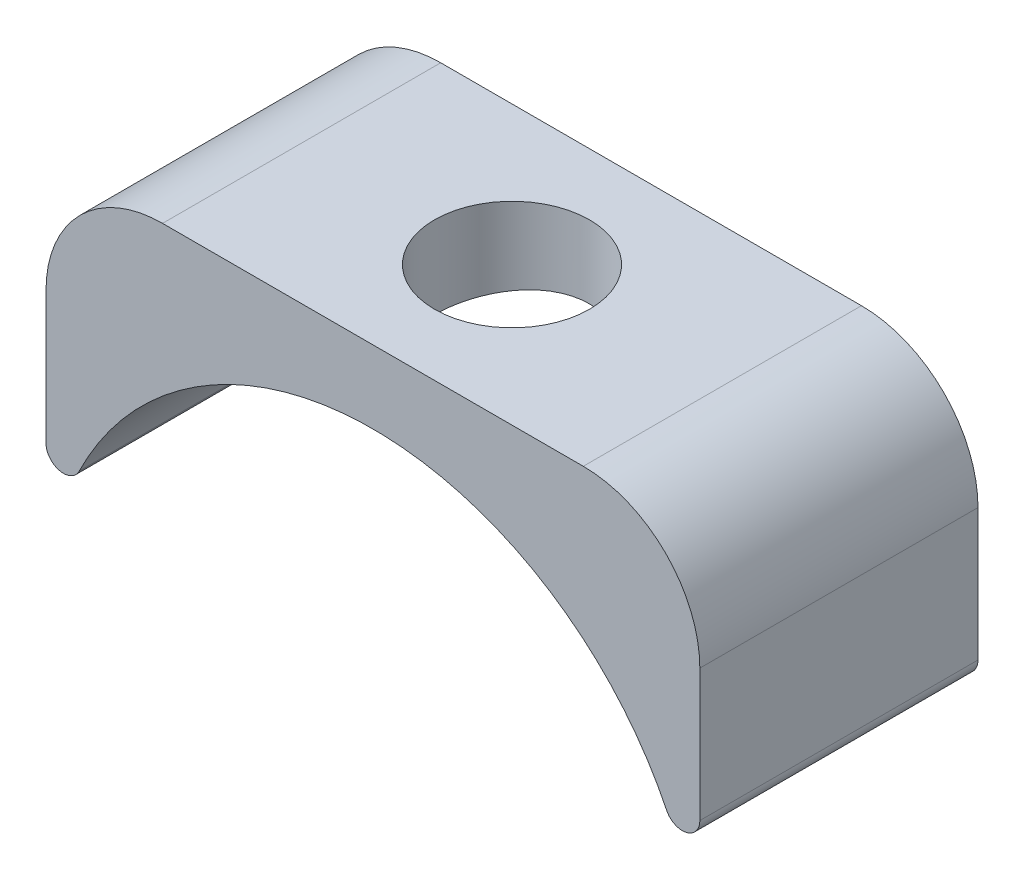
ISO-10303-21;
HEADER;
FILE_DESCRIPTION(('STEP AP214'),'2;1');
FILE_NAME('part.step','',(''),(''),'','','');
FILE_SCHEMA(('AUTOMOTIVE_DESIGN { 1 0 10303 214 1 1 1 1 }'));
ENDSEC;
DATA;
#1=APPLICATION_CONTEXT('core data for automotive mechanical design processes');
#2=APPLICATION_PROTOCOL_DEFINITION('international standard','automotive_design',2000,#1);
#3=PRODUCT_CONTEXT('',#1,'mechanical');
#4=PRODUCT('Part','Part','',(#3));
#5=PRODUCT_RELATED_PRODUCT_CATEGORY('part','',(#4));
#6=PRODUCT_DEFINITION_FORMATION('','',#4);
#7=PRODUCT_DEFINITION_CONTEXT('part definition',#1,'design');
#8=PRODUCT_DEFINITION('design','',#6,#7);
#9=PRODUCT_DEFINITION_SHAPE('','',#8);
#10=(LENGTH_UNIT() NAMED_UNIT(*) SI_UNIT(.MILLI.,.METRE.));
#11=(NAMED_UNIT(*) PLANE_ANGLE_UNIT() SI_UNIT($,.RADIAN.));
#12=(NAMED_UNIT(*) SI_UNIT($,.STERADIAN.) SOLID_ANGLE_UNIT());
#13=UNCERTAINTY_MEASURE_WITH_UNIT(LENGTH_MEASURE(1.E-05),#10,'distance_accuracy_value','');
#14=(GEOMETRIC_REPRESENTATION_CONTEXT(3) GLOBAL_UNCERTAINTY_ASSIGNED_CONTEXT((#13)) GLOBAL_UNIT_ASSIGNED_CONTEXT((#10,
#11,#12)) REPRESENTATION_CONTEXT('',''));
#15=CARTESIAN_POINT('',(0.,0.,0.));
#16=DIRECTION('',(0.,0.,1.));
#17=DIRECTION('',(1.,0.,0.));
#18=AXIS2_PLACEMENT_3D('',#15,#16,#17);
#19=CARTESIAN_POINT('',(0.,0.,6.0625));
#20=DIRECTION('',(0.,0.,-1.));
#21=DIRECTION('',(-1.,0.,0.));
#22=AXIS2_PLACEMENT_3D('',#19,#20,#21);
#23=CYLINDRICAL_SURFACE('',#22,14.25);
#24=CARTESIAN_POINT('',(0.,0.,-6.0625));
#25=DIRECTION('',(0.,0.,-1.));
#26=DIRECTION('',(1.,0.,0.));
#27=AXIS2_PLACEMENT_3D('',#24,#25,#26);
#28=CIRCLE('',#27,14.25);
#29=CARTESIAN_POINT('',(-12.8033573141487,6.2559205146993,-6.0625));
#30=VERTEX_POINT('',#29);
#31=CARTESIAN_POINT('',(12.8033573141487,6.2559205146993,-6.0625));
#32=VERTEX_POINT('',#31);
#33=EDGE_CURVE('E147',#30,#32,#28,.T.);
#34=ORIENTED_EDGE('',*,*,#33,.T.);
#35=DIRECTION('',(0.,0.,-1.));
#36=VECTOR('',#35,1.);
#37=CARTESIAN_POINT('',(12.8033573141487,6.2559205146993,6.0625));
#38=LINE('',#37,#36);
#39=CARTESIAN_POINT('',(12.8033573141487,6.2559205146993,6.0625));
#40=VERTEX_POINT('',#39);
#41=EDGE_CURVE('E130',#40,#32,#38,.T.);
#42=ORIENTED_EDGE('',*,*,#41,.F.);
#43=CARTESIAN_POINT('',(0.,0.,6.0625));
#44=DIRECTION('',(0.,0.,-1.));
#45=DIRECTION('',(1.,0.,0.));
#46=AXIS2_PLACEMENT_3D('',#43,#44,#45);
#47=CIRCLE('',#46,14.25);
#48=CARTESIAN_POINT('',(-12.8033573141487,6.2559205146993,6.0625));
#49=VERTEX_POINT('',#48);
#50=EDGE_CURVE('E121',#49,#40,#47,.T.);
#51=ORIENTED_EDGE('',*,*,#50,.F.);
#52=DIRECTION('',(0.,0.,-1.));
#53=VECTOR('',#52,1.);
#54=CARTESIAN_POINT('',(-12.8033573141487,6.2559205146993,6.0625));
#55=LINE('',#54,#53);
#56=EDGE_CURVE('E157',#49,#30,#55,.T.);
#57=ORIENTED_EDGE('',*,*,#56,.T.);
#58=EDGE_LOOP('',(#34,#42,#51,#57));
#59=FACE_BOUND('',#58,.T.);
#60=CARTESIAN_POINT('',(0.,14.25,-3.3782));
#61=CARTESIAN_POINT('',(0.186954700350283,14.2499966694241,-3.37819422864205));
#62=CARTESIAN_POINT('',(0.373976018191338,14.2462838619071,-3.36262816176052));
#63=CARTESIAN_POINT('',(0.742679010707961,14.2318319752717,-3.3008561035296));
#64=CARTESIAN_POINT('',(0.924357246047173,14.2210884696497,-3.25463080898669));
#65=CARTESIAN_POINT('',(1.27699467379397,14.1937676751066,-3.1330910646087));
#66=CARTESIAN_POINT('',(1.44796577307573,14.1771970070486,-3.05780961914467));
#67=CARTESIAN_POINT('',(1.77484938231894,14.1399967535684,-2.88040589011572));
#68=CARTESIAN_POINT('',(1.9307617619454,14.1193671330202,-2.77828337426664));
#69=CARTESIAN_POINT('',(2.22601363231564,14.0758669577643,-2.54808207249761));
#70=CARTESIAN_POINT('',(2.36503202327017,14.0529646723246,-2.41959741821536));
#71=CARTESIAN_POINT('',(2.61976164903309,14.0077165749994,-2.14118902773542));
#72=CARTESIAN_POINT('',(2.73547050146267,13.9853708201992,-1.99126310278241));
#73=CARTESIAN_POINT('',(2.94176642670209,13.9434491293676,-1.67178587326716));
#74=CARTESIAN_POINT('',(3.03200175817358,13.9239136452175,-1.50200165194687));
#75=CARTESIAN_POINT('',(3.18252971279599,13.8902841437412,-1.14913764280696));
#76=CARTESIAN_POINT('',(3.24282659757037,13.8761893520169,-0.966059751545599));
#77=CARTESIAN_POINT('',(3.33068523809319,13.8553620306302,-0.595316338001835));
#78=CARTESIAN_POINT('',(3.35882064084633,13.8485006608895,-0.407794158709812));
#79=CARTESIAN_POINT('',(3.38334318414301,13.8425308647387,-0.030575457095961));
#80=CARTESIAN_POINT('',(3.37973494091751,13.8434213110422,0.159120745067823));
#81=CARTESIAN_POINT('',(3.34133198982255,13.8527383593685,0.530963666470885));
#82=CARTESIAN_POINT('',(3.3072133586022,13.8610015799676,0.713184934004107));
#83=CARTESIAN_POINT('',(3.20983345521899,13.8838736385679,1.06924088138233));
#84=CARTESIAN_POINT('',(3.14657029460418,13.8984828877634,1.24307501696741));
#85=CARTESIAN_POINT('',(2.99210206005609,13.9325555700394,1.57927252353044));
#86=CARTESIAN_POINT('',(2.90064540570433,13.9520624027226,1.74151572168701));
#87=CARTESIAN_POINT('',(2.69256263127066,13.9937069346652,2.04859836877698));
#88=CARTESIAN_POINT('',(2.57593251968308,14.0158450508907,2.19343505205543));
#89=CARTESIAN_POINT('',(2.31727852609093,14.0609513235252,2.46547562615334));
#90=CARTESIAN_POINT('',(2.17468218948328,14.0839262390471,2.59213473247844));
#91=CARTESIAN_POINT('',(1.87000315494472,14.127605454042,2.81983916108243));
#92=CARTESIAN_POINT('',(1.70791997400251,14.1483096972085,2.92088384827565));
#93=CARTESIAN_POINT('',(1.36813923336816,14.1852015531419,3.09466275674795));
#94=CARTESIAN_POINT('',(1.19039867977757,14.2013761854488,3.16731584709817));
#95=CARTESIAN_POINT('',(0.824760487821015,14.2272912745446,3.28156579969323));
#96=CARTESIAN_POINT('',(0.636864597308872,14.2370328347504,3.32316798802769));
#97=CARTESIAN_POINT('',(0.260913646190725,14.2488235420503,3.37332025017736));
#98=CARTESIAN_POINT('',(0.0729629612287158,14.2510455422452,3.38261316107572));
#99=CARTESIAN_POINT('',(-0.301806425378044,14.2480356827696,3.36991019170019));
#100=CARTESIAN_POINT('',(-0.488625216823737,14.242804422405,3.34791682711074));
#101=CARTESIAN_POINT('',(-0.853297837469661,14.2255858999618,3.27387970206871));
#102=CARTESIAN_POINT('',(-1.03123719737865,14.2136882931548,3.22223450424287));
#103=CARTESIAN_POINT('',(-1.37592233613894,14.1844733197189,3.09080944791766));
#104=CARTESIAN_POINT('',(-1.54266705290376,14.1671554397242,3.01102692438036));
#105=CARTESIAN_POINT('',(-1.86323524611785,14.128601084118,2.82410628334147));
#106=CARTESIAN_POINT('',(-2.01680372893946,14.1073053228816,2.71654336593501));
#107=CARTESIAN_POINT('',(-2.30397620370402,14.0632619556087,2.47766511436536));
#108=CARTESIAN_POINT('',(-2.43757711086354,14.0405141260158,2.34634611704661));
#109=CARTESIAN_POINT('',(-2.68403073121929,13.9955187951539,2.06025012857931));
#110=CARTESIAN_POINT('',(-2.79636500882587,13.9732931596883,1.90502240670327));
#111=CARTESIAN_POINT('',(-2.99338094474638,13.9324202663078,1.57747421981043));
#112=CARTESIAN_POINT('',(-3.0780638403012,13.9137728483035,1.40515452001163));
#113=CARTESIAN_POINT('',(-3.21676086885464,13.8823632438295,1.04925462084144));
#114=CARTESIAN_POINT('',(-3.27095524443213,13.8695665550158,0.865747863838384));
#115=CARTESIAN_POINT('',(-3.34763817299038,13.8512599327267,0.491883212950041));
#116=CARTESIAN_POINT('',(-3.37013283999655,13.8457485941149,0.301526647474972));
#117=CARTESIAN_POINT('',(-3.38248313947027,13.8427359775409,-0.0753802768879382));
#118=CARTESIAN_POINT('',(-3.37316434297905,13.8450320872038,-0.261902421337589));
#119=CARTESIAN_POINT('',(-3.32402290618432,13.8569115821673,-0.630635482460821));
#120=CARTESIAN_POINT('',(-3.28420076379231,13.8664948485182,-0.812846469456137));
#121=CARTESIAN_POINT('',(-3.17561234736145,13.8917618500694,-1.16699095762672));
#122=CARTESIAN_POINT('',(-3.10698609547472,13.907416045729,-1.33896964284235));
#123=CARTESIAN_POINT('',(-2.94285120672544,13.9430681267994,-1.66908780002319));
#124=CARTESIAN_POINT('',(-2.84733922509144,13.9630665525919,-1.82722554686862));
#125=CARTESIAN_POINT('',(-2.62949185184191,14.0057433334902,-2.12919722018572));
#126=CARTESIAN_POINT('',(-2.50657685065407,14.028473778979,-2.27260572106458));
#127=CARTESIAN_POINT('',(-2.23856173632682,14.0737264867252,-2.53703051805714));
#128=CARTESIAN_POINT('',(-2.09345643462761,14.0962486989837,-2.65804156250893));
#129=CARTESIAN_POINT('',(-1.7824077716143,14.1389718921028,-2.87609129856108));
#130=CARTESIAN_POINT('',(-1.61617087118619,14.1591304776264,-2.97272012489587));
#131=CARTESIAN_POINT('',(-1.26935821404642,14.1944181905987,-3.13650756214019));
#132=CARTESIAN_POINT('',(-1.08879362245354,14.2095511875581,-3.20368885932952));
#133=CARTESIAN_POINT('',(-0.75693547223874,14.2306444059281,-3.29583342514684));
#134=CARTESIAN_POINT('',(-0.607321118358056,14.2378550409466,-3.32665758476367));
#135=CARTESIAN_POINT('',(-0.305152518115486,14.2475340535266,-3.36784260741831));
#136=CARTESIAN_POINT('',(-0.152598450511074,14.2500027185233,-3.37820471076833));
#137=CARTESIAN_POINT('',(0.,14.25,-3.3782));
#138=B_SPLINE_CURVE_WITH_KNOTS('',3,(#60,#61,#62,#63,#64,#65,#66,#67,#68,#69,#70,#71,#72,#73,
#74,#75,#76,#77,#78,#79,#80,#81,#82,#83,#84,#85,#86,#87,#88,#89,#90,#91,#92,#93,#94,#95,#96,#97,
#98,#99,#100,#101,#102,#103,#104,#105,#106,#107,#108,#109,#110,#111,#112,#113,#114,#115,#116,
#117,#118,#119,#120,#121,#122,#123,#124,#125,#126,#127,#128,#129,#130,#131,#132,#133,#134,#135,
#136,#137),.UNSPECIFIED.,.T.,.F.,(4,2,2,2,2,2,2,2,2,2,2,2,2,2,2,2,2,2,2,2,2,2,2,2,2,2,2,2,2,2,2,
2,2,2,2,2,2,2,4),(0.,0.560305167035859,1.1209634401301,1.68098673669239,2.24101487988774,
2.81041734625217,3.37987797957223,3.95685494224972,4.53374975089909,5.10018586240628,
5.66653960288747,6.22064626916715,6.77478884445086,7.3340268290198,7.89335355164103,
8.46696474634175,9.04059016180722,9.61584296989278,10.1909970835002,10.7528368195152,
11.3146313813583,11.8690457407722,12.4235126258705,12.9870195866491,13.5506135136226,
14.1265495927015,14.702459898409,15.2749287525317,15.8472871776145,16.4049068046845,
16.9625173298249,17.5174480385207,18.0724478149842,18.6405399519201,19.2087651244409,
19.7859865050854,20.3627624113304,20.8201292671581,21.2774683987382),.UNSPECIFIED.);
#139=CARTESIAN_POINT('',(0.,14.25,-3.3782));
#140=VERTEX_POINT('',#139);
#141=EDGE_CURVE('E40',#140,#140,#138,.T.);
#142=ORIENTED_EDGE('',*,*,#141,.F.);
#143=EDGE_LOOP('',(#142));
#144=FACE_BOUND('',#143,.T.);
#145=ADVANCED_FACE('F36',(#59,#144),#23,.F.);
#146=CARTESIAN_POINT('',(-9.17,17.425,6.0625));
#147=DIRECTION('',(0.,-1.,0.));
#148=DIRECTION('',(1.,0.,0.));
#149=AXIS2_PLACEMENT_3D('',#146,#147,#148);
#150=PLANE('',#149);
#151=CARTESIAN_POINT('',(0.,17.425,0.));
#152=DIRECTION('',(0.,1.,0.));
#153=DIRECTION('',(0.,0.,1.));
#154=AXIS2_PLACEMENT_3D('',#151,#152,#153);
#155=CIRCLE('',#154,3.3782);
#156=CARTESIAN_POINT('',(0.,17.425,3.3782));
#157=VERTEX_POINT('',#156);
#158=EDGE_CURVE('E188',#157,#157,#155,.T.);
#159=ORIENTED_EDGE('',*,*,#158,.F.);
#160=EDGE_LOOP('',(#159));
#161=FACE_BOUND('',#160,.T.);
#162=DIRECTION('',(-1.,0.,0.));
#163=VECTOR('',#162,1.);
#164=CARTESIAN_POINT('',(-9.17,17.425,-6.0625));
#165=LINE('',#164,#163);
#166=CARTESIAN_POINT('',(9.17,17.425,-6.0625));
#167=VERTEX_POINT('',#166);
#168=CARTESIAN_POINT('',(-9.17,17.425,-6.0625));
#169=VERTEX_POINT('',#168);
#170=EDGE_CURVE('E95',#167,#169,#165,.T.);
#171=ORIENTED_EDGE('',*,*,#170,.T.);
#172=DIRECTION('',(0.,0.,-1.));
#173=VECTOR('',#172,1.);
#174=CARTESIAN_POINT('',(-9.17,17.425,6.0625));
#175=LINE('',#174,#173);
#176=CARTESIAN_POINT('',(-9.17,17.425,6.0625));
#177=VERTEX_POINT('',#176);
#178=EDGE_CURVE('E11',#177,#169,#175,.T.);
#179=ORIENTED_EDGE('',*,*,#178,.F.);
#180=DIRECTION('',(-1.,0.,0.));
#181=VECTOR('',#180,1.);
#182=CARTESIAN_POINT('',(0.,17.425,6.0625));
#183=LINE('',#182,#181);
#184=CARTESIAN_POINT('',(9.17,17.425,6.0625));
#185=VERTEX_POINT('',#184);
#186=EDGE_CURVE('E101',#185,#177,#183,.T.);
#187=ORIENTED_EDGE('',*,*,#186,.F.);
#188=DIRECTION('',(0.,0.,-1.));
#189=VECTOR('',#188,1.);
#190=CARTESIAN_POINT('',(9.17,17.425,6.0625));
#191=LINE('',#190,#189);
#192=EDGE_CURVE('E135',#185,#167,#191,.T.);
#193=ORIENTED_EDGE('',*,*,#192,.T.);
#194=EDGE_LOOP('',(#171,#179,#187,#193));
#195=FACE_BOUND('',#194,.T.);
#196=ADVANCED_FACE('F38',(#161,#195),#150,.F.);
#197=CARTESIAN_POINT('',(-9.17,12.345,6.0625));
#198=DIRECTION('',(0.,0.,-1.));
#199=DIRECTION('',(-1.,0.,0.));
#200=AXIS2_PLACEMENT_3D('',#197,#198,#199);
#201=CYLINDRICAL_SURFACE('',#200,5.08);
#202=CARTESIAN_POINT('',(-9.17,12.345,-6.0625));
#203=DIRECTION('',(0.,0.,1.));
#204=DIRECTION('',(1.,0.,0.));
#205=AXIS2_PLACEMENT_3D('',#202,#203,#204);
#206=CIRCLE('',#205,5.08);
#207=CARTESIAN_POINT('',(-14.25,12.345,-6.0625));
#208=VERTEX_POINT('',#207);
#209=EDGE_CURVE('E140',#169,#208,#206,.T.);
#210=ORIENTED_EDGE('',*,*,#209,.T.);
#211=DIRECTION('',(0.,0.,-1.));
#212=VECTOR('',#211,1.);
#213=CARTESIAN_POINT('',(-14.25,12.345,6.0625));
#214=LINE('',#213,#212);
#215=CARTESIAN_POINT('',(-14.25,12.345,6.0625));
#216=VERTEX_POINT('',#215);
#217=EDGE_CURVE('E51',#216,#208,#214,.T.);
#218=ORIENTED_EDGE('',*,*,#217,.F.);
#219=CARTESIAN_POINT('',(-9.17,12.345,6.0625));
#220=DIRECTION('',(0.,0.,1.));
#221=DIRECTION('',(1.,0.,0.));
#222=AXIS2_PLACEMENT_3D('',#219,#220,#221);
#223=CIRCLE('',#222,5.08);
#224=EDGE_CURVE('E185',#177,#216,#223,.T.);
#225=ORIENTED_EDGE('',*,*,#224,.F.);
#226=ORIENTED_EDGE('',*,*,#178,.T.);
#227=EDGE_LOOP('',(#210,#218,#225,#226));
#228=FACE_BOUND('',#227,.T.);
#229=ADVANCED_FACE('F200',(#228),#201,.T.);
#230=CARTESIAN_POINT('',(-14.25,6.59044763274848,6.0625));
#231=DIRECTION('',(1.,0.,0.));
#232=DIRECTION('',(0.,0.,-1.));
#233=AXIS2_PLACEMENT_3D('',#230,#231,#232);
#234=PLANE('',#233);
#235=DIRECTION('',(0.,-1.,0.));
#236=VECTOR('',#235,1.);
#237=CARTESIAN_POINT('',(-14.25,6.59044763274848,-6.0625));
#238=LINE('',#237,#236);
#239=CARTESIAN_POINT('',(-14.25,6.59044763274848,-6.0625));
#240=VERTEX_POINT('',#239);
#241=EDGE_CURVE('E142',#208,#240,#238,.T.);
#242=ORIENTED_EDGE('',*,*,#241,.T.);
#243=DIRECTION('',(0.,0.,-1.));
#244=VECTOR('',#243,1.);
#245=CARTESIAN_POINT('',(-14.25,6.59044763274848,6.0625));
#246=LINE('',#245,#244);
#247=CARTESIAN_POINT('',(-14.25,6.59044763274848,6.0625));
#248=VERTEX_POINT('',#247);
#249=EDGE_CURVE('E160',#248,#240,#246,.T.);
#250=ORIENTED_EDGE('',*,*,#249,.F.);
#251=DIRECTION('',(0.,-1.,0.));
#252=VECTOR('',#251,1.);
#253=CARTESIAN_POINT('',(-14.25,6.59044763274848,6.0625));
#254=LINE('',#253,#252);
#255=EDGE_CURVE('E170',#216,#248,#254,.T.);
#256=ORIENTED_EDGE('',*,*,#255,.F.);
#257=ORIENTED_EDGE('',*,*,#217,.T.);
#258=EDGE_LOOP('',(#242,#250,#256,#257));
#259=FACE_BOUND('',#258,.T.);
#260=ADVANCED_FACE('F168',(#259),#234,.F.);
#261=CARTESIAN_POINT('',(-13.488,6.59044763274848,6.0625));
#262=DIRECTION('',(0.,0.,-1.));
#263=DIRECTION('',(-1.,0.,0.));
#264=AXIS2_PLACEMENT_3D('',#261,#262,#263);
#265=CYLINDRICAL_SURFACE('',#264,0.762);
#266=CARTESIAN_POINT('',(-13.488,6.59044763274848,-6.0625));
#267=DIRECTION('',(0.,0.,1.));
#268=DIRECTION('',(-1.,0.,0.));
#269=AXIS2_PLACEMENT_3D('',#266,#267,#268);
#270=CIRCLE('',#269,0.762);
#271=EDGE_CURVE('E144',#240,#30,#270,.T.);
#272=ORIENTED_EDGE('',*,*,#271,.T.);
#273=ORIENTED_EDGE('',*,*,#56,.F.);
#274=CARTESIAN_POINT('',(-13.488,6.59044763274848,6.0625));
#275=DIRECTION('',(0.,0.,1.));
#276=DIRECTION('',(-1.,0.,0.));
#277=AXIS2_PLACEMENT_3D('',#274,#275,#276);
#278=CIRCLE('',#277,0.762);
#279=EDGE_CURVE('E181',#248,#49,#278,.T.);
#280=ORIENTED_EDGE('',*,*,#279,.F.);
#281=ORIENTED_EDGE('',*,*,#249,.T.);
#282=EDGE_LOOP('',(#272,#273,#280,#281));
#283=FACE_BOUND('',#282,.T.);
#284=ADVANCED_FACE('F177',(#283),#265,.T.);
#285=CARTESIAN_POINT('',(13.488,6.59044763274848,6.0625));
#286=DIRECTION('',(0.,0.,-1.));
#287=DIRECTION('',(-1.,0.,0.));
#288=AXIS2_PLACEMENT_3D('',#285,#286,#287);
#289=CYLINDRICAL_SURFACE('',#288,0.762);
#290=CARTESIAN_POINT('',(13.488,6.59044763274848,-6.0625));
#291=DIRECTION('',(0.,0.,1.));
#292=DIRECTION('',(-1.,0.,0.));
#293=AXIS2_PLACEMENT_3D('',#290,#291,#292);
#294=CIRCLE('',#293,0.762);
#295=CARTESIAN_POINT('',(14.25,6.59044763274848,-6.0625));
#296=VERTEX_POINT('',#295);
#297=EDGE_CURVE('E129',#32,#296,#294,.T.);
#298=ORIENTED_EDGE('',*,*,#297,.T.);
#299=DIRECTION('',(0.,0.,-1.));
#300=VECTOR('',#299,1.);
#301=CARTESIAN_POINT('',(14.25,6.59044763274848,6.0625));
#302=LINE('',#301,#300);
#303=CARTESIAN_POINT('',(14.25,6.59044763274848,6.0625));
#304=VERTEX_POINT('',#303);
#305=EDGE_CURVE('E126',#304,#296,#302,.T.);
#306=ORIENTED_EDGE('',*,*,#305,.F.);
#307=CARTESIAN_POINT('',(13.488,6.59044763274848,6.0625));
#308=DIRECTION('',(0.,0.,1.));
#309=DIRECTION('',(-1.,0.,0.));
#310=AXIS2_PLACEMENT_3D('',#307,#308,#309);
#311=CIRCLE('',#310,0.762);
#312=EDGE_CURVE('E115',#40,#304,#311,.T.);
#313=ORIENTED_EDGE('',*,*,#312,.F.);
#314=ORIENTED_EDGE('',*,*,#41,.T.);
#315=EDGE_LOOP('',(#298,#306,#313,#314));
#316=FACE_BOUND('',#315,.T.);
#317=ADVANCED_FACE('F127',(#316),#289,.T.);
#318=CARTESIAN_POINT('',(14.25,12.345,6.0625));
#319=DIRECTION('',(-1.,0.,0.));
#320=DIRECTION('',(0.,-1.,0.));
#321=AXIS2_PLACEMENT_3D('',#318,#319,#320);
#322=PLANE('',#321);
#323=DIRECTION('',(0.,1.,0.));
#324=VECTOR('',#323,1.);
#325=CARTESIAN_POINT('',(14.25,12.345,-6.0625));
#326=LINE('',#325,#324);
#327=CARTESIAN_POINT('',(14.25,12.345,-6.0625));
#328=VERTEX_POINT('',#327);
#329=EDGE_CURVE('E88',#296,#328,#326,.T.);
#330=ORIENTED_EDGE('',*,*,#329,.T.);
#331=DIRECTION('',(0.,0.,-1.));
#332=VECTOR('',#331,1.);
#333=CARTESIAN_POINT('',(14.25,12.345,6.0625));
#334=LINE('',#333,#332);
#335=CARTESIAN_POINT('',(14.25,12.345,6.0625));
#336=VERTEX_POINT('',#335);
#337=EDGE_CURVE('E131',#336,#328,#334,.T.);
#338=ORIENTED_EDGE('',*,*,#337,.F.);
#339=DIRECTION('',(0.,1.,0.));
#340=VECTOR('',#339,1.);
#341=CARTESIAN_POINT('',(14.25,12.345,6.0625));
#342=LINE('',#341,#340);
#343=EDGE_CURVE('E119',#304,#336,#342,.T.);
#344=ORIENTED_EDGE('',*,*,#343,.F.);
#345=ORIENTED_EDGE('',*,*,#305,.T.);
#346=EDGE_LOOP('',(#330,#338,#344,#345));
#347=FACE_BOUND('',#346,.T.);
#348=ADVANCED_FACE('F133',(#347),#322,.F.);
#349=CARTESIAN_POINT('',(9.17,12.345,6.0625));
#350=DIRECTION('',(0.,0.,-1.));
#351=DIRECTION('',(-1.,0.,0.));
#352=AXIS2_PLACEMENT_3D('',#349,#350,#351);
#353=CYLINDRICAL_SURFACE('',#352,5.08);
#354=CARTESIAN_POINT('',(9.17,12.345,-6.0625));
#355=DIRECTION('',(0.,0.,1.));
#356=DIRECTION('',(-1.,0.,0.));
#357=AXIS2_PLACEMENT_3D('',#354,#355,#356);
#358=CIRCLE('',#357,5.08);
#359=EDGE_CURVE('E151',#328,#167,#358,.T.);
#360=ORIENTED_EDGE('',*,*,#359,.T.);
#361=ORIENTED_EDGE('',*,*,#192,.F.);
#362=CARTESIAN_POINT('',(9.17,12.345,6.0625));
#363=DIRECTION('',(0.,0.,1.));
#364=DIRECTION('',(-1.,0.,0.));
#365=AXIS2_PLACEMENT_3D('',#362,#363,#364);
#366=CIRCLE('',#365,5.08);
#367=EDGE_CURVE('E59',#336,#185,#366,.T.);
#368=ORIENTED_EDGE('',*,*,#367,.F.);
#369=ORIENTED_EDGE('',*,*,#337,.T.);
#370=EDGE_LOOP('',(#360,#361,#368,#369));
#371=FACE_BOUND('',#370,.T.);
#372=ADVANCED_FACE('F214',(#371),#353,.T.);
#373=CARTESIAN_POINT('',(9.17,12.345,6.0625));
#374=DIRECTION('',(0.,0.,-1.));
#375=DIRECTION('',(-1.,0.,0.));
#376=AXIS2_PLACEMENT_3D('',#373,#374,#375);
#377=PLANE('',#376);
#378=ORIENTED_EDGE('',*,*,#186,.T.);
#379=ORIENTED_EDGE('',*,*,#224,.T.);
#380=ORIENTED_EDGE('',*,*,#255,.T.);
#381=ORIENTED_EDGE('',*,*,#279,.T.);
#382=ORIENTED_EDGE('',*,*,#50,.T.);
#383=ORIENTED_EDGE('',*,*,#312,.T.);
#384=ORIENTED_EDGE('',*,*,#343,.T.);
#385=ORIENTED_EDGE('',*,*,#367,.T.);
#386=EDGE_LOOP('',(#378,#379,#380,#381,#382,#383,#384,#385));
#387=FACE_BOUND('',#386,.T.);
#388=ADVANCED_FACE('F117',(#387),#377,.F.);
#389=CARTESIAN_POINT('',(9.17,12.345,-6.0625));
#390=DIRECTION('',(0.,0.,-1.));
#391=DIRECTION('',(-1.,0.,0.));
#392=AXIS2_PLACEMENT_3D('',#389,#390,#391);
#393=PLANE('',#392);
#394=ORIENTED_EDGE('',*,*,#170,.F.);
#395=ORIENTED_EDGE('',*,*,#359,.F.);
#396=ORIENTED_EDGE('',*,*,#329,.F.);
#397=ORIENTED_EDGE('',*,*,#297,.F.);
#398=ORIENTED_EDGE('',*,*,#33,.F.);
#399=ORIENTED_EDGE('',*,*,#271,.F.);
#400=ORIENTED_EDGE('',*,*,#241,.F.);
#401=ORIENTED_EDGE('',*,*,#209,.F.);
#402=EDGE_LOOP('',(#394,#395,#396,#397,#398,#399,#400,#401));
#403=FACE_BOUND('',#402,.T.);
#404=ADVANCED_FACE('F174',(#403),#393,.T.);
#405=CARTESIAN_POINT('',(0.,5.82844763274848,0.));
#406=DIRECTION('',(0.,-1.,0.));
#407=DIRECTION('',(0.,0.,-1.));
#408=AXIS2_PLACEMENT_3D('',#405,#406,#407);
#409=CYLINDRICAL_SURFACE('',#408,3.3782);
#410=ORIENTED_EDGE('',*,*,#158,.T.);
#411=EDGE_LOOP('',(#410));
#412=FACE_BOUND('',#411,.T.);
#413=ORIENTED_EDGE('',*,*,#141,.T.);
#414=EDGE_LOOP('',(#413));
#415=FACE_BOUND('',#414,.T.);
#416=ADVANCED_FACE('F195',(#412,#415),#409,.F.);
#417=CLOSED_SHELL('',(#145,#196,#229,#260,#284,#317,#348,#372,#388,#404,#416));
#418=MANIFOLD_SOLID_BREP('B2',#417);
#419=ADVANCED_BREP_SHAPE_REPRESENTATION('',(#18,#418),#14);
#420=SHAPE_DEFINITION_REPRESENTATION(#9,#419);
ENDSEC;
END-ISO-10303-21;
